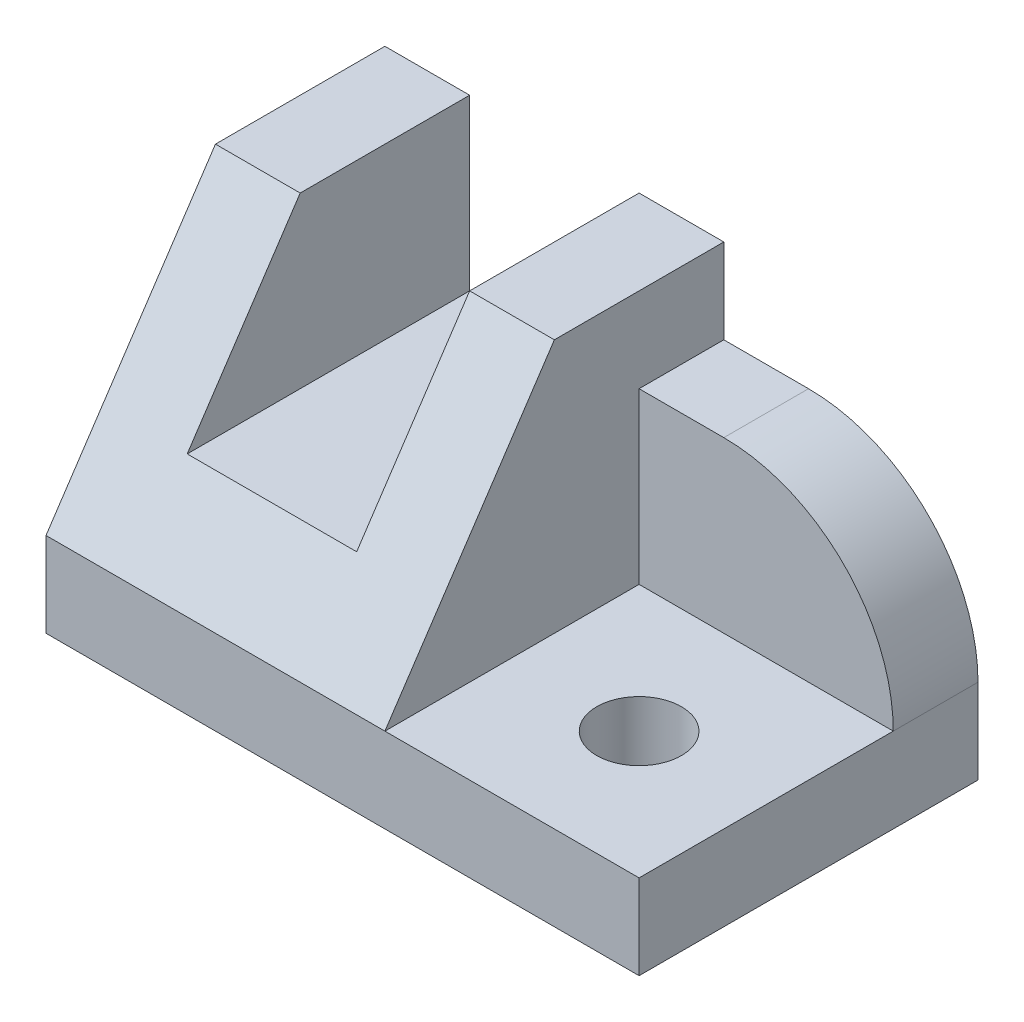
ISO-10303-21;
HEADER;
FILE_DESCRIPTION(('STEP AP214'),'2;1');
FILE_NAME('part.step','',(''),(''),'','','');
FILE_SCHEMA(('AUTOMOTIVE_DESIGN { 1 0 10303 214 1 1 1 1 }'));
ENDSEC;
DATA;
#1=APPLICATION_CONTEXT('core data for automotive mechanical design processes');
#2=APPLICATION_PROTOCOL_DEFINITION('international standard','automotive_design',2000,#1);
#3=PRODUCT_CONTEXT('',#1,'mechanical');
#4=PRODUCT('Part','Part','',(#3));
#5=PRODUCT_RELATED_PRODUCT_CATEGORY('part','',(#4));
#6=PRODUCT_DEFINITION_FORMATION('','',#4);
#7=PRODUCT_DEFINITION_CONTEXT('part definition',#1,'design');
#8=PRODUCT_DEFINITION('design','',#6,#7);
#9=PRODUCT_DEFINITION_SHAPE('','',#8);
#10=(LENGTH_UNIT() NAMED_UNIT(*) SI_UNIT(.MILLI.,.METRE.));
#11=(NAMED_UNIT(*) PLANE_ANGLE_UNIT() SI_UNIT($,.RADIAN.));
#12=(NAMED_UNIT(*) SI_UNIT($,.STERADIAN.) SOLID_ANGLE_UNIT());
#13=UNCERTAINTY_MEASURE_WITH_UNIT(LENGTH_MEASURE(1.E-05),#10,'distance_accuracy_value','');
#14=(GEOMETRIC_REPRESENTATION_CONTEXT(3) GLOBAL_UNCERTAINTY_ASSIGNED_CONTEXT((#13)) GLOBAL_UNIT_ASSIGNED_CONTEXT((#10,
#11,#12)) REPRESENTATION_CONTEXT('',''));
#15=CARTESIAN_POINT('',(0.,0.,0.));
#16=DIRECTION('',(0.,0.,1.));
#17=DIRECTION('',(1.,0.,0.));
#18=AXIS2_PLACEMENT_3D('',#15,#16,#17);
#19=CARTESIAN_POINT('',(0.,0.,40.));
#20=DIRECTION('',(0.,0.,-1.));
#21=DIRECTION('',(-1.,0.,0.));
#22=AXIS2_PLACEMENT_3D('',#19,#20,#21);
#23=CYLINDRICAL_SURFACE('',#22,20.);
#24=DIRECTION('',(0.,0.,-1.));
#25=VECTOR('',#24,1.);
#26=CARTESIAN_POINT('',(0.,20.,40.));
#27=LINE('',#26,#25);
#28=CARTESIAN_POINT('',(0.,20.,10.));
#29=VERTEX_POINT('',#28);
#30=CARTESIAN_POINT('',(0.,20.,0.));
#31=VERTEX_POINT('',#30);
#32=EDGE_CURVE('E43',#29,#31,#27,.T.);
#33=ORIENTED_EDGE('',*,*,#32,.F.);
#34=CARTESIAN_POINT('',(0.,0.,10.));
#35=DIRECTION('',(0.,0.,-1.));
#36=DIRECTION('',(-1.,0.,0.));
#37=AXIS2_PLACEMENT_3D('',#34,#35,#36);
#38=CIRCLE('',#37,20.);
#39=CARTESIAN_POINT('',(20.,0.,10.));
#40=VERTEX_POINT('',#39);
#41=EDGE_CURVE('E241',#29,#40,#38,.T.);
#42=ORIENTED_EDGE('',*,*,#41,.T.);
#43=DIRECTION('',(0.,0.,-1.));
#44=VECTOR('',#43,1.);
#45=CARTESIAN_POINT('',(20.,0.,40.));
#46=LINE('',#45,#44);
#47=CARTESIAN_POINT('',(20.,0.,0.));
#48=VERTEX_POINT('',#47);
#49=EDGE_CURVE('E149',#40,#48,#46,.T.);
#50=ORIENTED_EDGE('',*,*,#49,.T.);
#51=CARTESIAN_POINT('',(0.,0.,0.));
#52=DIRECTION('',(0.,0.,1.));
#53=DIRECTION('',(1.,0.,0.));
#54=AXIS2_PLACEMENT_3D('',#51,#52,#53);
#55=CIRCLE('',#54,20.);
#56=EDGE_CURVE('E194',#48,#31,#55,.T.);
#57=ORIENTED_EDGE('',*,*,#56,.T.);
#58=EDGE_LOOP('',(#33,#42,#50,#57));
#59=FACE_BOUND('',#58,.T.);
#60=ADVANCED_FACE('F36',(#59),#23,.T.);
#61=CARTESIAN_POINT('',(0.,20.,40.));
#62=DIRECTION('',(0.,-1.,0.));
#63=DIRECTION('',(0.,0.,-1.));
#64=AXIS2_PLACEMENT_3D('',#61,#62,#63);
#65=PLANE('',#64);
#66=DIRECTION('',(0.,0.,-1.));
#67=VECTOR('',#66,1.);
#68=CARTESIAN_POINT('',(-10.,20.,40.));
#69=LINE('',#68,#67);
#70=CARTESIAN_POINT('',(-10.,20.,10.));
#71=VERTEX_POINT('',#70);
#72=CARTESIAN_POINT('',(-10.,20.,0.));
#73=VERTEX_POINT('',#72);
#74=EDGE_CURVE('E176',#71,#73,#69,.T.);
#75=ORIENTED_EDGE('',*,*,#74,.F.);
#76=DIRECTION('',(-1.,0.,0.));
#77=VECTOR('',#76,1.);
#78=CARTESIAN_POINT('',(-10.,20.,10.));
#79=LINE('',#78,#77);
#80=EDGE_CURVE('E186',#29,#71,#79,.T.);
#81=ORIENTED_EDGE('',*,*,#80,.F.);
#82=ORIENTED_EDGE('',*,*,#32,.T.);
#83=DIRECTION('',(-1.,0.,0.));
#84=VECTOR('',#83,1.);
#85=CARTESIAN_POINT('',(0.,20.,0.));
#86=LINE('',#85,#84);
#87=EDGE_CURVE('E184',#31,#73,#86,.T.);
#88=ORIENTED_EDGE('',*,*,#87,.T.);
#89=EDGE_LOOP('',(#75,#81,#82,#88));
#90=FACE_BOUND('',#89,.T.);
#91=ADVANCED_FACE('F183',(#90),#65,.F.);
#92=CARTESIAN_POINT('',(-10.,20.,40.));
#93=DIRECTION('',(-1.,0.,0.));
#94=DIRECTION('',(0.,0.,1.));
#95=AXIS2_PLACEMENT_3D('',#92,#93,#94);
#96=PLANE('',#95);
#97=DIRECTION('',(0.,0.,-1.));
#98=VECTOR('',#97,1.);
#99=CARTESIAN_POINT('',(-10.,30.,40.));
#100=LINE('',#99,#98);
#101=CARTESIAN_POINT('',(-10.,30.,20.));
#102=VERTEX_POINT('',#101);
#103=CARTESIAN_POINT('',(-10.,30.,0.));
#104=VERTEX_POINT('',#103);
#105=EDGE_CURVE('E174',#102,#104,#100,.T.);
#106=ORIENTED_EDGE('',*,*,#105,.F.);
#107=DIRECTION('',(0.,-0.832050294337844,0.554700196225229));
#108=VECTOR('',#107,1.);
#109=CARTESIAN_POINT('',(-10.,13.8461538461538,30.7692307692308));
#110=LINE('',#109,#108);
#111=CARTESIAN_POINT('',(-10.,0.,40.));
#112=VERTEX_POINT('',#111);
#113=EDGE_CURVE('E50',#102,#112,#110,.T.);
#114=ORIENTED_EDGE('',*,*,#113,.T.);
#115=DIRECTION('',(0.,0.,1.));
#116=VECTOR('',#115,1.);
#117=CARTESIAN_POINT('',(-10.,0.,10.));
#118=LINE('',#117,#116);
#119=CARTESIAN_POINT('',(-10.,0.,10.));
#120=VERTEX_POINT('',#119);
#121=EDGE_CURVE('E137',#120,#112,#118,.T.);
#122=ORIENTED_EDGE('',*,*,#121,.F.);
#123=DIRECTION('',(0.,1.,0.));
#124=VECTOR('',#123,1.);
#125=CARTESIAN_POINT('',(-10.,0.,10.));
#126=LINE('',#125,#124);
#127=EDGE_CURVE('E243',#120,#71,#126,.T.);
#128=ORIENTED_EDGE('',*,*,#127,.T.);
#129=ORIENTED_EDGE('',*,*,#74,.T.);
#130=DIRECTION('',(0.,1.,0.));
#131=VECTOR('',#130,1.);
#132=CARTESIAN_POINT('',(-10.,20.,0.));
#133=LINE('',#132,#131);
#134=EDGE_CURVE('E197',#73,#104,#133,.T.);
#135=ORIENTED_EDGE('',*,*,#134,.T.);
#136=EDGE_LOOP('',(#106,#114,#122,#128,#129,#135));
#137=FACE_BOUND('',#136,.T.);
#138=ADVANCED_FACE('F274',(#137),#96,.F.);
#139=CARTESIAN_POINT('',(-10.,30.,40.));
#140=DIRECTION('',(0.,-1.,0.));
#141=DIRECTION('',(1.,0.,0.));
#142=AXIS2_PLACEMENT_3D('',#139,#140,#141);
#143=PLANE('',#142);
#144=DIRECTION('',(0.,0.,-1.));
#145=VECTOR('',#144,1.);
#146=CARTESIAN_POINT('',(-20.,30.,40.));
#147=LINE('',#146,#145);
#148=CARTESIAN_POINT('',(-20.,30.,20.));
#149=VERTEX_POINT('',#148);
#150=CARTESIAN_POINT('',(-20.,30.,0.));
#151=VERTEX_POINT('',#150);
#152=EDGE_CURVE('E172',#149,#151,#147,.T.);
#153=ORIENTED_EDGE('',*,*,#152,.F.);
#154=DIRECTION('',(-1.,0.,0.));
#155=VECTOR('',#154,1.);
#156=CARTESIAN_POINT('',(41.,30.,20.));
#157=LINE('',#156,#155);
#158=EDGE_CURVE('E237',#102,#149,#157,.T.);
#159=ORIENTED_EDGE('',*,*,#158,.F.);
#160=ORIENTED_EDGE('',*,*,#105,.T.);
#161=DIRECTION('',(-1.,0.,0.));
#162=VECTOR('',#161,1.);
#163=CARTESIAN_POINT('',(-10.,30.,0.));
#164=LINE('',#163,#162);
#165=EDGE_CURVE('E205',#104,#151,#164,.T.);
#166=ORIENTED_EDGE('',*,*,#165,.T.);
#167=EDGE_LOOP('',(#153,#159,#160,#166));
#168=FACE_BOUND('',#167,.T.);
#169=ADVANCED_FACE('F278',(#168),#143,.F.);
#170=CARTESIAN_POINT('',(-20.,30.,40.));
#171=DIRECTION('',(1.,0.,0.));
#172=DIRECTION('',(0.,0.,-1.));
#173=AXIS2_PLACEMENT_3D('',#170,#171,#172);
#174=PLANE('',#173);
#175=DIRECTION('',(0.,0.,-1.));
#176=VECTOR('',#175,1.);
#177=CARTESIAN_POINT('',(-20.,10.,40.));
#178=LINE('',#177,#176);
#179=CARTESIAN_POINT('',(-20.,10.,33.3333333333333));
#180=VERTEX_POINT('',#179);
#181=CARTESIAN_POINT('',(-20.,10.,0.));
#182=VERTEX_POINT('',#181);
#183=EDGE_CURVE('E170',#180,#182,#178,.T.);
#184=ORIENTED_EDGE('',*,*,#183,.F.);
#185=DIRECTION('',(0.,0.832050294337844,-0.554700196225229));
#186=VECTOR('',#185,1.);
#187=CARTESIAN_POINT('',(-20.,20.7692307692308,26.1538461538462));
#188=LINE('',#187,#186);
#189=EDGE_CURVE('E200',#180,#149,#188,.T.);
#190=ORIENTED_EDGE('',*,*,#189,.T.);
#191=ORIENTED_EDGE('',*,*,#152,.T.);
#192=DIRECTION('',(0.,-1.,0.));
#193=VECTOR('',#192,1.);
#194=CARTESIAN_POINT('',(-20.,30.,0.));
#195=LINE('',#194,#193);
#196=EDGE_CURVE('E208',#151,#182,#195,.T.);
#197=ORIENTED_EDGE('',*,*,#196,.T.);
#198=EDGE_LOOP('',(#184,#190,#191,#197));
#199=FACE_BOUND('',#198,.T.);
#200=ADVANCED_FACE('F283',(#199),#174,.F.);
#201=CARTESIAN_POINT('',(-20.,10.,40.));
#202=DIRECTION('',(0.,-1.,0.));
#203=DIRECTION('',(1.,0.,0.));
#204=AXIS2_PLACEMENT_3D('',#201,#202,#203);
#205=PLANE('',#204);
#206=DIRECTION('',(0.,0.,-1.));
#207=VECTOR('',#206,1.);
#208=CARTESIAN_POINT('',(-40.,10.,40.));
#209=LINE('',#208,#207);
#210=CARTESIAN_POINT('',(-40.,10.,33.3333333333333));
#211=VERTEX_POINT('',#210);
#212=CARTESIAN_POINT('',(-40.,10.,0.));
#213=VERTEX_POINT('',#212);
#214=EDGE_CURVE('E168',#211,#213,#209,.T.);
#215=ORIENTED_EDGE('',*,*,#214,.F.);
#216=DIRECTION('',(1.,0.,0.));
#217=VECTOR('',#216,1.);
#218=CARTESIAN_POINT('',(-20.,10.,33.3333333333333));
#219=LINE('',#218,#217);
#220=EDGE_CURVE('E231',#211,#180,#219,.T.);
#221=ORIENTED_EDGE('',*,*,#220,.T.);
#222=ORIENTED_EDGE('',*,*,#183,.T.);
#223=DIRECTION('',(-1.,0.,0.));
#224=VECTOR('',#223,1.);
#225=CARTESIAN_POINT('',(-20.,10.,0.));
#226=LINE('',#225,#224);
#227=EDGE_CURVE('E211',#182,#213,#226,.T.);
#228=ORIENTED_EDGE('',*,*,#227,.T.);
#229=EDGE_LOOP('',(#215,#221,#222,#228));
#230=FACE_BOUND('',#229,.T.);
#231=ADVANCED_FACE('F287',(#230),#205,.F.);
#232=CARTESIAN_POINT('',(-40.,10.,40.));
#233=DIRECTION('',(-1.,0.,0.));
#234=DIRECTION('',(0.,0.,1.));
#235=AXIS2_PLACEMENT_3D('',#232,#233,#234);
#236=PLANE('',#235);
#237=DIRECTION('',(0.,0.,-1.));
#238=VECTOR('',#237,1.);
#239=CARTESIAN_POINT('',(-40.,30.,40.));
#240=LINE('',#239,#238);
#241=CARTESIAN_POINT('',(-40.,30.,20.));
#242=VERTEX_POINT('',#241);
#243=CARTESIAN_POINT('',(-40.,30.,0.));
#244=VERTEX_POINT('',#243);
#245=EDGE_CURVE('E166',#242,#244,#240,.T.);
#246=ORIENTED_EDGE('',*,*,#245,.F.);
#247=DIRECTION('',(0.,-0.832050294337844,0.554700196225229));
#248=VECTOR('',#247,1.);
#249=CARTESIAN_POINT('',(-40.,6.92307692307693,35.3846153846154));
#250=LINE('',#249,#248);
#251=EDGE_CURVE('E234',#242,#211,#250,.T.);
#252=ORIENTED_EDGE('',*,*,#251,.T.);
#253=ORIENTED_EDGE('',*,*,#214,.T.);
#254=DIRECTION('',(0.,1.,0.));
#255=VECTOR('',#254,1.);
#256=CARTESIAN_POINT('',(-40.,10.,0.));
#257=LINE('',#256,#255);
#258=EDGE_CURVE('E214',#213,#244,#257,.T.);
#259=ORIENTED_EDGE('',*,*,#258,.T.);
#260=EDGE_LOOP('',(#246,#252,#253,#259));
#261=FACE_BOUND('',#260,.T.);
#262=ADVANCED_FACE('F291',(#261),#236,.F.);
#263=CARTESIAN_POINT('',(-40.,30.,40.));
#264=DIRECTION('',(0.,-1.,0.));
#265=DIRECTION('',(0.,0.,-1.));
#266=AXIS2_PLACEMENT_3D('',#263,#264,#265);
#267=PLANE('',#266);
#268=DIRECTION('',(0.,0.,-1.));
#269=VECTOR('',#268,1.);
#270=CARTESIAN_POINT('',(-50.,30.,40.));
#271=LINE('',#270,#269);
#272=CARTESIAN_POINT('',(-50.,30.,20.));
#273=VERTEX_POINT('',#272);
#274=CARTESIAN_POINT('',(-50.,30.,0.));
#275=VERTEX_POINT('',#274);
#276=EDGE_CURVE('E164',#273,#275,#271,.T.);
#277=ORIENTED_EDGE('',*,*,#276,.F.);
#278=EDGE_CURVE('E238',#242,#273,#157,.T.);
#279=ORIENTED_EDGE('',*,*,#278,.F.);
#280=ORIENTED_EDGE('',*,*,#245,.T.);
#281=DIRECTION('',(-1.,0.,0.));
#282=VECTOR('',#281,1.);
#283=CARTESIAN_POINT('',(-40.,30.,0.));
#284=LINE('',#283,#282);
#285=EDGE_CURVE('E217',#244,#275,#284,.T.);
#286=ORIENTED_EDGE('',*,*,#285,.T.);
#287=EDGE_LOOP('',(#277,#279,#280,#286));
#288=FACE_BOUND('',#287,.T.);
#289=ADVANCED_FACE('F295',(#288),#267,.F.);
#290=CARTESIAN_POINT('',(-50.,30.,40.));
#291=DIRECTION('',(1.,0.,0.));
#292=DIRECTION('',(0.,1.,0.));
#293=AXIS2_PLACEMENT_3D('',#290,#291,#292);
#294=PLANE('',#293);
#295=DIRECTION('',(0.,-1.,0.));
#296=VECTOR('',#295,1.);
#297=CARTESIAN_POINT('',(-50.,30.,40.));
#298=LINE('',#297,#296);
#299=CARTESIAN_POINT('',(-50.,0.,40.));
#300=VERTEX_POINT('',#299);
#301=CARTESIAN_POINT('',(-50.,-10.,40.));
#302=VERTEX_POINT('',#301);
#303=EDGE_CURVE('E224',#300,#302,#298,.T.);
#304=ORIENTED_EDGE('',*,*,#303,.F.);
#305=DIRECTION('',(0.,-0.832050294337844,0.554700196225229));
#306=VECTOR('',#305,1.);
#307=CARTESIAN_POINT('',(-50.,30.,20.));
#308=LINE('',#307,#306);
#309=EDGE_CURVE('E57',#273,#300,#308,.T.);
#310=ORIENTED_EDGE('',*,*,#309,.F.);
#311=ORIENTED_EDGE('',*,*,#276,.T.);
#312=DIRECTION('',(0.,-1.,0.));
#313=VECTOR('',#312,1.);
#314=CARTESIAN_POINT('',(-50.,30.,0.));
#315=LINE('',#314,#313);
#316=CARTESIAN_POINT('',(-50.,-10.,0.));
#317=VERTEX_POINT('',#316);
#318=EDGE_CURVE('E220',#275,#317,#315,.T.);
#319=ORIENTED_EDGE('',*,*,#318,.T.);
#320=DIRECTION('',(0.,0.,-1.));
#321=VECTOR('',#320,1.);
#322=CARTESIAN_POINT('',(-50.,-10.,40.));
#323=LINE('',#322,#321);
#324=EDGE_CURVE('E156',#302,#317,#323,.T.);
#325=ORIENTED_EDGE('',*,*,#324,.F.);
#326=EDGE_LOOP('',(#304,#310,#311,#319,#325));
#327=FACE_BOUND('',#326,.T.);
#328=ADVANCED_FACE('F299',(#327),#294,.F.);
#329=CARTESIAN_POINT('',(-50.,-10.,40.));
#330=DIRECTION('',(0.,1.,0.));
#331=DIRECTION('',(0.,0.,1.));
#332=AXIS2_PLACEMENT_3D('',#329,#330,#331);
#333=PLANE('',#332);
#334=CARTESIAN_POINT('',(5.,-10.,25.));
#335=DIRECTION('',(0.,1.,0.));
#336=DIRECTION('',(0.,0.,1.));
#337=AXIS2_PLACEMENT_3D('',#334,#335,#336);
#338=CIRCLE('',#337,5.);
#339=CARTESIAN_POINT('',(5.,-10.,30.));
#340=VERTEX_POINT('',#339);
#341=EDGE_CURVE('E247',#340,#340,#338,.T.);
#342=ORIENTED_EDGE('',*,*,#341,.T.);
#343=EDGE_LOOP('',(#342));
#344=FACE_BOUND('',#343,.T.);
#345=DIRECTION('',(1.,0.,0.));
#346=VECTOR('',#345,1.);
#347=CARTESIAN_POINT('',(-50.,-10.,0.));
#348=LINE('',#347,#346);
#349=CARTESIAN_POINT('',(20.,-10.,0.));
#350=VERTEX_POINT('',#349);
#351=EDGE_CURVE('E221',#317,#350,#348,.T.);
#352=ORIENTED_EDGE('',*,*,#351,.T.);
#353=DIRECTION('',(0.,0.,-1.));
#354=VECTOR('',#353,1.);
#355=CARTESIAN_POINT('',(20.,-10.,40.));
#356=LINE('',#355,#354);
#357=CARTESIAN_POINT('',(20.,-10.,40.));
#358=VERTEX_POINT('',#357);
#359=EDGE_CURVE('E154',#358,#350,#356,.T.);
#360=ORIENTED_EDGE('',*,*,#359,.F.);
#361=DIRECTION('',(1.,0.,0.));
#362=VECTOR('',#361,1.);
#363=CARTESIAN_POINT('',(-50.,-10.,40.));
#364=LINE('',#363,#362);
#365=EDGE_CURVE('E145',#302,#358,#364,.T.);
#366=ORIENTED_EDGE('',*,*,#365,.F.);
#367=ORIENTED_EDGE('',*,*,#324,.T.);
#368=EDGE_LOOP('',(#352,#360,#366,#367));
#369=FACE_BOUND('',#368,.T.);
#370=ADVANCED_FACE('F303',(#344,#369),#333,.F.);
#371=CARTESIAN_POINT('',(20.,-10.,40.));
#372=DIRECTION('',(-1.,0.,0.));
#373=DIRECTION('',(0.,0.,1.));
#374=AXIS2_PLACEMENT_3D('',#371,#372,#373);
#375=PLANE('',#374);
#376=DIRECTION('',(0.,1.,0.));
#377=VECTOR('',#376,1.);
#378=CARTESIAN_POINT('',(20.,-10.,0.));
#379=LINE('',#378,#377);
#380=EDGE_CURVE('E159',#350,#48,#379,.T.);
#381=ORIENTED_EDGE('',*,*,#380,.T.);
#382=ORIENTED_EDGE('',*,*,#49,.F.);
#383=CARTESIAN_POINT('',(20.,0.,40.));
#384=VERTEX_POINT('',#383);
#385=EDGE_CURVE('E135',#384,#40,#46,.T.);
#386=ORIENTED_EDGE('',*,*,#385,.F.);
#387=DIRECTION('',(0.,1.,0.));
#388=VECTOR('',#387,1.);
#389=CARTESIAN_POINT('',(20.,-10.,40.));
#390=LINE('',#389,#388);
#391=EDGE_CURVE('E142',#358,#384,#390,.T.);
#392=ORIENTED_EDGE('',*,*,#391,.F.);
#393=ORIENTED_EDGE('',*,*,#359,.T.);
#394=EDGE_LOOP('',(#381,#382,#386,#392,#393));
#395=FACE_BOUND('',#394,.T.);
#396=ADVANCED_FACE('F153',(#395),#375,.F.);
#397=CARTESIAN_POINT('',(0.,0.,40.));
#398=DIRECTION('',(0.,0.,1.));
#399=DIRECTION('',(1.,0.,0.));
#400=AXIS2_PLACEMENT_3D('',#397,#398,#399);
#401=PLANE('',#400);
#402=DIRECTION('',(1.,0.,0.));
#403=VECTOR('',#402,1.);
#404=CARTESIAN_POINT('',(0.,0.,40.));
#405=LINE('',#404,#403);
#406=EDGE_CURVE('E11',#300,#112,#405,.T.);
#407=ORIENTED_EDGE('',*,*,#406,.F.);
#408=ORIENTED_EDGE('',*,*,#303,.T.);
#409=ORIENTED_EDGE('',*,*,#365,.T.);
#410=ORIENTED_EDGE('',*,*,#391,.T.);
#411=DIRECTION('',(1.,0.,0.));
#412=VECTOR('',#411,1.);
#413=CARTESIAN_POINT('',(-10.,0.,40.));
#414=LINE('',#413,#412);
#415=EDGE_CURVE('E130',#112,#384,#414,.T.);
#416=ORIENTED_EDGE('',*,*,#415,.F.);
#417=EDGE_LOOP('',(#407,#408,#409,#410,#416));
#418=FACE_BOUND('',#417,.T.);
#419=ADVANCED_FACE('F143',(#418),#401,.T.);
#420=CARTESIAN_POINT('',(0.,0.,0.));
#421=DIRECTION('',(0.,0.,1.));
#422=DIRECTION('',(1.,0.,0.));
#423=AXIS2_PLACEMENT_3D('',#420,#421,#422);
#424=PLANE('',#423);
#425=ORIENTED_EDGE('',*,*,#56,.F.);
#426=ORIENTED_EDGE('',*,*,#380,.F.);
#427=ORIENTED_EDGE('',*,*,#351,.F.);
#428=ORIENTED_EDGE('',*,*,#318,.F.);
#429=ORIENTED_EDGE('',*,*,#285,.F.);
#430=ORIENTED_EDGE('',*,*,#258,.F.);
#431=ORIENTED_EDGE('',*,*,#227,.F.);
#432=ORIENTED_EDGE('',*,*,#196,.F.);
#433=ORIENTED_EDGE('',*,*,#165,.F.);
#434=ORIENTED_EDGE('',*,*,#134,.F.);
#435=ORIENTED_EDGE('',*,*,#87,.F.);
#436=EDGE_LOOP('',(#425,#426,#427,#428,#429,#430,#431,#432,#433,#434,#435));
#437=FACE_BOUND('',#436,.T.);
#438=ADVANCED_FACE('F192',(#437),#424,.F.);
#439=CARTESIAN_POINT('',(41.,30.,20.));
#440=DIRECTION('',(0.,-0.554700196225229,-0.832050294337844));
#441=DIRECTION('',(0.,0.832050294337844,-0.554700196225229));
#442=AXIS2_PLACEMENT_3D('',#439,#440,#441);
#443=PLANE('',#442);
#444=ORIENTED_EDGE('',*,*,#406,.T.);
#445=ORIENTED_EDGE('',*,*,#113,.F.);
#446=ORIENTED_EDGE('',*,*,#158,.T.);
#447=ORIENTED_EDGE('',*,*,#189,.F.);
#448=ORIENTED_EDGE('',*,*,#220,.F.);
#449=ORIENTED_EDGE('',*,*,#251,.F.);
#450=ORIENTED_EDGE('',*,*,#278,.T.);
#451=ORIENTED_EDGE('',*,*,#309,.T.);
#452=EDGE_LOOP('',(#444,#445,#446,#447,#448,#449,#450,#451));
#453=FACE_BOUND('',#452,.T.);
#454=ADVANCED_FACE('F267',(#453),#443,.F.);
#455=CARTESIAN_POINT('',(-10.,0.,10.));
#456=DIRECTION('',(0.,0.,-1.));
#457=DIRECTION('',(-1.,0.,0.));
#458=AXIS2_PLACEMENT_3D('',#455,#456,#457);
#459=PLANE('',#458);
#460=ORIENTED_EDGE('',*,*,#80,.T.);
#461=ORIENTED_EDGE('',*,*,#127,.F.);
#462=DIRECTION('',(-1.,0.,0.));
#463=VECTOR('',#462,1.);
#464=CARTESIAN_POINT('',(-10.,0.,10.));
#465=LINE('',#464,#463);
#466=EDGE_CURVE('E139',#40,#120,#465,.T.);
#467=ORIENTED_EDGE('',*,*,#466,.F.);
#468=ORIENTED_EDGE('',*,*,#41,.F.);
#469=EDGE_LOOP('',(#460,#461,#467,#468));
#470=FACE_BOUND('',#469,.T.);
#471=ADVANCED_FACE('F260',(#470),#459,.F.);
#472=CARTESIAN_POINT('',(0.,0.,0.));
#473=DIRECTION('',(0.,1.,0.));
#474=DIRECTION('',(0.,0.,1.));
#475=AXIS2_PLACEMENT_3D('',#472,#473,#474);
#476=PLANE('',#475);
#477=CARTESIAN_POINT('',(5.,0.,25.));
#478=DIRECTION('',(0.,1.,0.));
#479=DIRECTION('',(0.,0.,1.));
#480=AXIS2_PLACEMENT_3D('',#477,#478,#479);
#481=CIRCLE('',#480,5.);
#482=CARTESIAN_POINT('',(5.,0.,30.));
#483=VERTEX_POINT('',#482);
#484=EDGE_CURVE('E252',#483,#483,#481,.T.);
#485=ORIENTED_EDGE('',*,*,#484,.F.);
#486=EDGE_LOOP('',(#485));
#487=FACE_BOUND('',#486,.T.);
#488=ORIENTED_EDGE('',*,*,#121,.T.);
#489=ORIENTED_EDGE('',*,*,#415,.T.);
#490=ORIENTED_EDGE('',*,*,#385,.T.);
#491=ORIENTED_EDGE('',*,*,#466,.T.);
#492=EDGE_LOOP('',(#488,#489,#490,#491));
#493=FACE_BOUND('',#492,.T.);
#494=ADVANCED_FACE('F132',(#487,#493),#476,.T.);
#495=CARTESIAN_POINT('',(5.,-20.,25.));
#496=DIRECTION('',(0.,1.,0.));
#497=DIRECTION('',(0.,0.,1.));
#498=AXIS2_PLACEMENT_3D('',#495,#496,#497);
#499=CYLINDRICAL_SURFACE('',#498,5.);
#500=ORIENTED_EDGE('',*,*,#484,.T.);
#501=EDGE_LOOP('',(#500));
#502=FACE_BOUND('',#501,.T.);
#503=ORIENTED_EDGE('',*,*,#341,.F.);
#504=EDGE_LOOP('',(#503));
#505=FACE_BOUND('',#504,.T.);
#506=ADVANCED_FACE('F256',(#502,#505),#499,.F.);
#507=CLOSED_SHELL('',(#60,#91,#138,#169,#200,#231,#262,#289,#328,#370,#396,#419,#438,#454,#471,
#494,#506));
#508=MANIFOLD_SOLID_BREP('B2',#507);
#509=ADVANCED_BREP_SHAPE_REPRESENTATION('',(#18,#508),#14);
#510=SHAPE_DEFINITION_REPRESENTATION(#9,#509);
ENDSEC;
END-ISO-10303-21;
